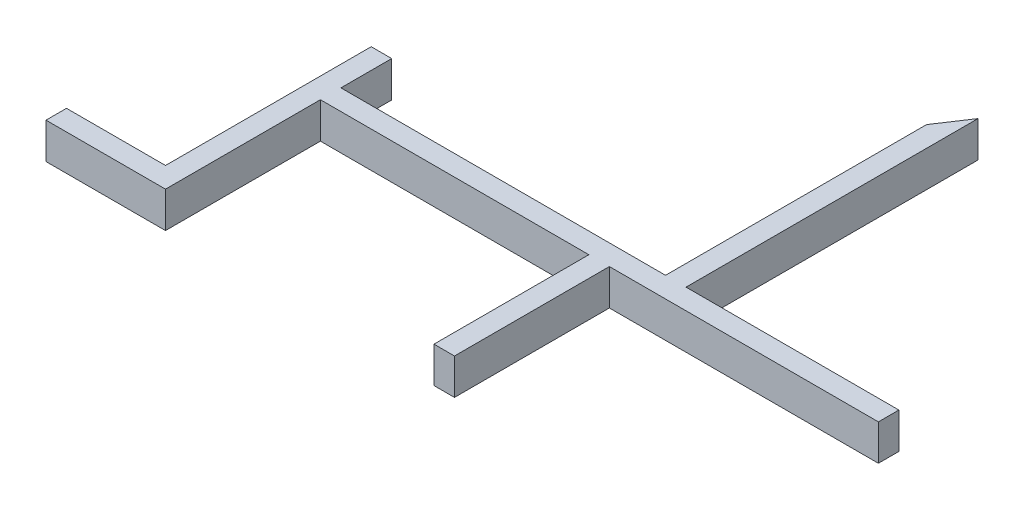
ISO-10303-21;
HEADER;
FILE_DESCRIPTION(('STEP AP214'),'2;1');
FILE_NAME('part.step','',(''),(''),'','','');
FILE_SCHEMA(('AUTOMOTIVE_DESIGN { 1 0 10303 214 1 1 1 1 }'));
ENDSEC;
DATA;
#1=APPLICATION_CONTEXT('core data for automotive mechanical design processes');
#2=APPLICATION_PROTOCOL_DEFINITION('international standard','automotive_design',2000,#1);
#3=PRODUCT_CONTEXT('',#1,'mechanical');
#4=PRODUCT('Part','Part','',(#3));
#5=PRODUCT_RELATED_PRODUCT_CATEGORY('part','',(#4));
#6=PRODUCT_DEFINITION_FORMATION('','',#4);
#7=PRODUCT_DEFINITION_CONTEXT('part definition',#1,'design');
#8=PRODUCT_DEFINITION('design','',#6,#7);
#9=PRODUCT_DEFINITION_SHAPE('','',#8);
#10=(LENGTH_UNIT() NAMED_UNIT(*) SI_UNIT(.MILLI.,.METRE.));
#11=(NAMED_UNIT(*) PLANE_ANGLE_UNIT() SI_UNIT($,.RADIAN.));
#12=(NAMED_UNIT(*) SI_UNIT($,.STERADIAN.) SOLID_ANGLE_UNIT());
#13=UNCERTAINTY_MEASURE_WITH_UNIT(LENGTH_MEASURE(1.E-05),#10,'distance_accuracy_value','');
#14=(GEOMETRIC_REPRESENTATION_CONTEXT(3) GLOBAL_UNCERTAINTY_ASSIGNED_CONTEXT((#13)) GLOBAL_UNIT_ASSIGNED_CONTEXT((#10,
#11,#12)) REPRESENTATION_CONTEXT('',''));
#15=CARTESIAN_POINT('',(0.,0.,0.));
#16=DIRECTION('',(0.,0.,1.));
#17=DIRECTION('',(1.,0.,0.));
#18=AXIS2_PLACEMENT_3D('',#15,#16,#17);
#19=CARTESIAN_POINT('',(-35.6052154613306,-0.01,12.3260604981837));
#20=DIRECTION('',(0.833432778374377,0.,0.552620850069165));
#21=DIRECTION('',(0.552620850069165,0.,-0.833432778374377));
#22=AXIS2_PLACEMENT_3D('',#19,#20,#21);
#23=PLANE('',#22);
#24=DIRECTION('',(0.552620850069165,0.,-0.833432778374377));
#25=VECTOR('',#24,1.);
#26=CARTESIAN_POINT('',(-19.0547032836192,7.,-12.6345238627983));
#27=LINE('',#26,#25);
#28=CARTESIAN_POINT('',(-26.3442212969307,7.,-1.64086835724872));
#29=VERTEX_POINT('',#28);
#30=CARTESIAN_POINT('',(-22.3442212969307,7.,-7.67345129920658));
#31=VERTEX_POINT('',#30);
#32=EDGE_CURVE('E11',#29,#31,#27,.T.);
#33=ORIENTED_EDGE('',*,*,#32,.T.);
#34=DIRECTION('',(0.,1.,0.));
#35=VECTOR('',#34,1.);
#36=CARTESIAN_POINT('',(-22.3442212969307,7.,-7.67345129920659));
#37=LINE('',#36,#35);
#38=CARTESIAN_POINT('',(-22.3442212969307,0.,-7.67345129920658));
#39=VERTEX_POINT('',#38);
#40=EDGE_CURVE('E62',#39,#31,#37,.T.);
#41=ORIENTED_EDGE('',*,*,#40,.F.);
#42=DIRECTION('',(0.552620850069165,0.,-0.833432778374377));
#43=VECTOR('',#42,1.);
#44=CARTESIAN_POINT('',(-19.0547032836192,0.,-12.6345238627983));
#45=LINE('',#44,#43);
#46=CARTESIAN_POINT('',(-26.3442212969307,0.,-1.64086835724872));
#47=VERTEX_POINT('',#46);
#48=EDGE_CURVE('E182',#47,#39,#45,.T.);
#49=ORIENTED_EDGE('',*,*,#48,.F.);
#50=DIRECTION('',(0.,-1.,0.));
#51=VECTOR('',#50,1.);
#52=CARTESIAN_POINT('',(-26.3442212969307,7.,-1.64086835724872));
#53=LINE('',#52,#51);
#54=EDGE_CURVE('E49',#29,#47,#53,.T.);
#55=ORIENTED_EDGE('',*,*,#54,.F.);
#56=EDGE_LOOP('',(#33,#41,#49,#55));
#57=FACE_BOUND('',#56,.T.);
#58=ADVANCED_FACE('F42',(#57),#23,.F.);
#59=CARTESIAN_POINT('',(0.,7.,49.2669812670384));
#60=DIRECTION('',(0.,0.,1.));
#61=DIRECTION('',(1.,0.,0.));
#62=AXIS2_PLACEMENT_3D('',#59,#60,#61);
#63=PLANE('',#62);
#64=DIRECTION('',(-1.,0.,0.));
#65=VECTOR('',#64,1.);
#66=CARTESIAN_POINT('',(0.,0.,49.2669812670384));
#67=LINE('',#66,#65);
#68=CARTESIAN_POINT('',(-26.3442212969307,0.,49.2669812670384));
#69=VERTEX_POINT('',#68);
#70=CARTESIAN_POINT('',(-89.6546773788586,0.,49.2669812670384));
#71=VERTEX_POINT('',#70);
#72=EDGE_CURVE('E222',#69,#71,#67,.T.);
#73=ORIENTED_EDGE('',*,*,#72,.T.);
#74=DIRECTION('',(0.,-1.,0.));
#75=VECTOR('',#74,1.);
#76=CARTESIAN_POINT('',(-89.6546773788586,7.,49.2669812670384));
#77=LINE('',#76,#75);
#78=CARTESIAN_POINT('',(-89.6546773788586,7.,49.2669812670384));
#79=VERTEX_POINT('',#78);
#80=EDGE_CURVE('E183',#79,#71,#77,.T.);
#81=ORIENTED_EDGE('',*,*,#80,.F.);
#82=DIRECTION('',(-1.,0.,0.));
#83=VECTOR('',#82,1.);
#84=CARTESIAN_POINT('',(0.,7.,49.2669812670384));
#85=LINE('',#84,#83);
#86=CARTESIAN_POINT('',(-26.3442212969307,7.,49.2669812670384));
#87=VERTEX_POINT('',#86);
#88=EDGE_CURVE('E169',#87,#79,#85,.T.);
#89=ORIENTED_EDGE('',*,*,#88,.F.);
#90=DIRECTION('',(0.,-1.,0.));
#91=VECTOR('',#90,1.);
#92=CARTESIAN_POINT('',(-26.3442212969307,7.,49.2669812670384));
#93=LINE('',#92,#91);
#94=EDGE_CURVE('E176',#87,#69,#93,.T.);
#95=ORIENTED_EDGE('',*,*,#94,.T.);
#96=EDGE_LOOP('',(#73,#81,#89,#95));
#97=FACE_BOUND('',#96,.T.);
#98=ADVANCED_FACE('F185',(#97),#63,.F.);
#99=CARTESIAN_POINT('',(-89.6546773788586,7.,0.));
#100=DIRECTION('',(-1.,0.,0.));
#101=DIRECTION('',(0.,0.,1.));
#102=AXIS2_PLACEMENT_3D('',#99,#100,#101);
#103=PLANE('',#102);
#104=DIRECTION('',(0.,0.,-1.));
#105=VECTOR('',#104,1.);
#106=CARTESIAN_POINT('',(-89.6546773788586,0.,0.));
#107=LINE('',#106,#105);
#108=CARTESIAN_POINT('',(-89.6546773788586,0.,39.3594010694854));
#109=VERTEX_POINT('',#108);
#110=EDGE_CURVE('E224',#71,#109,#107,.T.);
#111=ORIENTED_EDGE('',*,*,#110,.T.);
#112=DIRECTION('',(0.,-1.,0.));
#113=VECTOR('',#112,1.);
#114=CARTESIAN_POINT('',(-89.6546773788586,7.,39.3594010694854));
#115=LINE('',#114,#113);
#116=CARTESIAN_POINT('',(-89.6546773788586,7.,39.3594010694854));
#117=VERTEX_POINT('',#116);
#118=EDGE_CURVE('E291',#117,#109,#115,.T.);
#119=ORIENTED_EDGE('',*,*,#118,.F.);
#120=DIRECTION('',(0.,0.,-1.));
#121=VECTOR('',#120,1.);
#122=CARTESIAN_POINT('',(-89.6546773788586,7.,0.));
#123=LINE('',#122,#121);
#124=EDGE_CURVE('E188',#79,#117,#123,.T.);
#125=ORIENTED_EDGE('',*,*,#124,.F.);
#126=ORIENTED_EDGE('',*,*,#80,.T.);
#127=EDGE_LOOP('',(#111,#119,#125,#126));
#128=FACE_BOUND('',#127,.T.);
#129=ADVANCED_FACE('F302',(#128),#103,.F.);
#130=CARTESIAN_POINT('',(0.,7.,39.3594010694854));
#131=DIRECTION('',(0.,0.,1.));
#132=DIRECTION('',(1.,0.,0.));
#133=AXIS2_PLACEMENT_3D('',#130,#131,#132);
#134=PLANE('',#133);
#135=DIRECTION('',(-1.,0.,0.));
#136=VECTOR('',#135,1.);
#137=CARTESIAN_POINT('',(0.,0.,39.3594010694854));
#138=LINE('',#137,#136);
#139=CARTESIAN_POINT('',(-93.6546773788586,0.,39.3594010694854));
#140=VERTEX_POINT('',#139);
#141=EDGE_CURVE('E226',#109,#140,#138,.T.);
#142=ORIENTED_EDGE('',*,*,#141,.T.);
#143=DIRECTION('',(0.,-1.,0.));
#144=VECTOR('',#143,1.);
#145=CARTESIAN_POINT('',(-93.6546773788586,7.,39.3594010694854));
#146=LINE('',#145,#144);
#147=CARTESIAN_POINT('',(-93.6546773788586,7.,39.3594010694854));
#148=VERTEX_POINT('',#147);
#149=EDGE_CURVE('E288',#148,#140,#146,.T.);
#150=ORIENTED_EDGE('',*,*,#149,.F.);
#151=DIRECTION('',(-1.,0.,0.));
#152=VECTOR('',#151,1.);
#153=CARTESIAN_POINT('',(0.,7.,39.3594010694854));
#154=LINE('',#153,#152);
#155=EDGE_CURVE('E190',#117,#148,#154,.T.);
#156=ORIENTED_EDGE('',*,*,#155,.F.);
#157=ORIENTED_EDGE('',*,*,#118,.T.);
#158=EDGE_LOOP('',(#142,#150,#156,#157));
#159=FACE_BOUND('',#158,.T.);
#160=ADVANCED_FACE('F309',(#159),#134,.F.);
#161=CARTESIAN_POINT('',(-93.6546773788586,7.,0.));
#162=DIRECTION('',(1.,0.,0.));
#163=DIRECTION('',(0.,0.,-1.));
#164=AXIS2_PLACEMENT_3D('',#161,#162,#163);
#165=PLANE('',#164);
#166=DIRECTION('',(0.,0.,1.));
#167=VECTOR('',#166,1.);
#168=CARTESIAN_POINT('',(-93.6546773788586,0.,0.));
#169=LINE('',#168,#167);
#170=CARTESIAN_POINT('',(-93.6546773788586,0.,79.4769799022003));
#171=VERTEX_POINT('',#170);
#172=EDGE_CURVE('E228',#140,#171,#169,.T.);
#173=ORIENTED_EDGE('',*,*,#172,.T.);
#174=DIRECTION('',(0.,-1.,0.));
#175=VECTOR('',#174,1.);
#176=CARTESIAN_POINT('',(-93.6546773788586,7.,79.4769799022003));
#177=LINE('',#176,#175);
#178=CARTESIAN_POINT('',(-93.6546773788586,7.,79.4769799022003));
#179=VERTEX_POINT('',#178);
#180=EDGE_CURVE('E285',#179,#171,#177,.T.);
#181=ORIENTED_EDGE('',*,*,#180,.F.);
#182=DIRECTION('',(0.,0.,1.));
#183=VECTOR('',#182,1.);
#184=CARTESIAN_POINT('',(-93.6546773788586,7.,0.));
#185=LINE('',#184,#183);
#186=EDGE_CURVE('E194',#148,#179,#185,.T.);
#187=ORIENTED_EDGE('',*,*,#186,.F.);
#188=ORIENTED_EDGE('',*,*,#149,.T.);
#189=EDGE_LOOP('',(#173,#181,#187,#188));
#190=FACE_BOUND('',#189,.T.);
#191=ADVANCED_FACE('F312',(#190),#165,.F.);
#192=CARTESIAN_POINT('',(0.,7.,79.4769799022003));
#193=DIRECTION('',(0.,0.,1.));
#194=DIRECTION('',(1.,0.,0.));
#195=AXIS2_PLACEMENT_3D('',#192,#193,#194);
#196=PLANE('',#195);
#197=DIRECTION('',(-1.,0.,0.));
#198=VECTOR('',#197,1.);
#199=CARTESIAN_POINT('',(0.,0.,79.4769799022003));
#200=LINE('',#199,#198);
#201=CARTESIAN_POINT('',(-112.961853745234,0.,79.4769799022003));
#202=VERTEX_POINT('',#201);
#203=EDGE_CURVE('E230',#171,#202,#200,.T.);
#204=ORIENTED_EDGE('',*,*,#203,.T.);
#205=DIRECTION('',(0.,-1.,0.));
#206=VECTOR('',#205,1.);
#207=CARTESIAN_POINT('',(-112.961853745234,7.,79.4769799022003));
#208=LINE('',#207,#206);
#209=CARTESIAN_POINT('',(-112.961853745234,7.,79.4769799022003));
#210=VERTEX_POINT('',#209);
#211=EDGE_CURVE('E282',#210,#202,#208,.T.);
#212=ORIENTED_EDGE('',*,*,#211,.F.);
#213=DIRECTION('',(-1.,0.,0.));
#214=VECTOR('',#213,1.);
#215=CARTESIAN_POINT('',(0.,7.,79.4769799022003));
#216=LINE('',#215,#214);
#217=EDGE_CURVE('E196',#179,#210,#216,.T.);
#218=ORIENTED_EDGE('',*,*,#217,.F.);
#219=ORIENTED_EDGE('',*,*,#180,.T.);
#220=EDGE_LOOP('',(#204,#212,#218,#219));
#221=FACE_BOUND('',#220,.T.);
#222=ADVANCED_FACE('F317',(#221),#196,.F.);
#223=CARTESIAN_POINT('',(-112.961853745234,7.,0.));
#224=DIRECTION('',(1.,0.,0.));
#225=DIRECTION('',(0.,0.,-1.));
#226=AXIS2_PLACEMENT_3D('',#223,#224,#225);
#227=PLANE('',#226);
#228=DIRECTION('',(0.,0.,1.));
#229=VECTOR('',#228,1.);
#230=CARTESIAN_POINT('',(-112.961853745234,0.,0.));
#231=LINE('',#230,#229);
#232=CARTESIAN_POINT('',(-112.961853745234,0.,83.4769799022003));
#233=VERTEX_POINT('',#232);
#234=EDGE_CURVE('E232',#202,#233,#231,.T.);
#235=ORIENTED_EDGE('',*,*,#234,.T.);
#236=DIRECTION('',(0.,-1.,0.));
#237=VECTOR('',#236,1.);
#238=CARTESIAN_POINT('',(-112.961853745234,7.,83.4769799022003));
#239=LINE('',#238,#237);
#240=CARTESIAN_POINT('',(-112.961853745234,7.,83.4769799022003));
#241=VERTEX_POINT('',#240);
#242=EDGE_CURVE('E279',#241,#233,#239,.T.);
#243=ORIENTED_EDGE('',*,*,#242,.F.);
#244=DIRECTION('',(0.,0.,1.));
#245=VECTOR('',#244,1.);
#246=CARTESIAN_POINT('',(-112.961853745234,7.,0.));
#247=LINE('',#246,#245);
#248=EDGE_CURVE('E198',#210,#241,#247,.T.);
#249=ORIENTED_EDGE('',*,*,#248,.F.);
#250=ORIENTED_EDGE('',*,*,#211,.T.);
#251=EDGE_LOOP('',(#235,#243,#249,#250));
#252=FACE_BOUND('',#251,.T.);
#253=ADVANCED_FACE('F323',(#252),#227,.F.);
#254=CARTESIAN_POINT('',(0.,7.,83.4769799022003));
#255=DIRECTION('',(0.,0.,-1.));
#256=DIRECTION('',(-1.,0.,0.));
#257=AXIS2_PLACEMENT_3D('',#254,#255,#256);
#258=PLANE('',#257);
#259=DIRECTION('',(1.,0.,0.));
#260=VECTOR('',#259,1.);
#261=CARTESIAN_POINT('',(0.,0.,83.4769799022003));
#262=LINE('',#261,#260);
#263=CARTESIAN_POINT('',(-89.6546773788586,0.,83.4769799022003));
#264=VERTEX_POINT('',#263);
#265=EDGE_CURVE('E234',#233,#264,#262,.T.);
#266=ORIENTED_EDGE('',*,*,#265,.T.);
#267=DIRECTION('',(0.,-1.,0.));
#268=VECTOR('',#267,1.);
#269=CARTESIAN_POINT('',(-89.6546773788586,7.,83.4769799022003));
#270=LINE('',#269,#268);
#271=CARTESIAN_POINT('',(-89.6546773788586,7.,83.4769799022003));
#272=VERTEX_POINT('',#271);
#273=EDGE_CURVE('E276',#272,#264,#270,.T.);
#274=ORIENTED_EDGE('',*,*,#273,.F.);
#275=DIRECTION('',(1.,0.,0.));
#276=VECTOR('',#275,1.);
#277=CARTESIAN_POINT('',(0.,7.,83.4769799022003));
#278=LINE('',#277,#276);
#279=EDGE_CURVE('E200',#241,#272,#278,.T.);
#280=ORIENTED_EDGE('',*,*,#279,.F.);
#281=ORIENTED_EDGE('',*,*,#242,.T.);
#282=EDGE_LOOP('',(#266,#274,#280,#281));
#283=FACE_BOUND('',#282,.T.);
#284=ADVANCED_FACE('F327',(#283),#258,.F.);
#285=CARTESIAN_POINT('',(-89.6546773788586,7.,0.));
#286=DIRECTION('',(-1.,0.,0.));
#287=DIRECTION('',(0.,0.,1.));
#288=AXIS2_PLACEMENT_3D('',#285,#286,#287);
#289=PLANE('',#288);
#290=DIRECTION('',(0.,0.,-1.));
#291=VECTOR('',#290,1.);
#292=CARTESIAN_POINT('',(-89.6546773788586,0.,0.));
#293=LINE('',#292,#291);
#294=CARTESIAN_POINT('',(-89.6546773788586,0.,53.2669812670384));
#295=VERTEX_POINT('',#294);
#296=EDGE_CURVE('E236',#264,#295,#293,.T.);
#297=ORIENTED_EDGE('',*,*,#296,.T.);
#298=DIRECTION('',(0.,-1.,0.));
#299=VECTOR('',#298,1.);
#300=CARTESIAN_POINT('',(-89.6546773788586,7.,53.2669812670384));
#301=LINE('',#300,#299);
#302=CARTESIAN_POINT('',(-89.6546773788586,7.,53.2669812670384));
#303=VERTEX_POINT('',#302);
#304=EDGE_CURVE('E273',#303,#295,#301,.T.);
#305=ORIENTED_EDGE('',*,*,#304,.F.);
#306=DIRECTION('',(0.,0.,-1.));
#307=VECTOR('',#306,1.);
#308=CARTESIAN_POINT('',(-89.6546773788586,7.,0.));
#309=LINE('',#308,#307);
#310=EDGE_CURVE('E202',#272,#303,#309,.T.);
#311=ORIENTED_EDGE('',*,*,#310,.F.);
#312=ORIENTED_EDGE('',*,*,#273,.T.);
#313=EDGE_LOOP('',(#297,#305,#311,#312));
#314=FACE_BOUND('',#313,.T.);
#315=ADVANCED_FACE('F332',(#314),#289,.F.);
#316=CARTESIAN_POINT('',(0.,7.,53.2669812670384));
#317=DIRECTION('',(0.,0.,-1.));
#318=DIRECTION('',(-1.,0.,0.));
#319=AXIS2_PLACEMENT_3D('',#316,#317,#318);
#320=PLANE('',#319);
#321=DIRECTION('',(1.,0.,0.));
#322=VECTOR('',#321,1.);
#323=CARTESIAN_POINT('',(0.,0.,53.2669812670384));
#324=LINE('',#323,#322);
#325=CARTESIAN_POINT('',(-37.2951637960566,0.,53.2669812670384));
#326=VERTEX_POINT('',#325);
#327=EDGE_CURVE('E238',#295,#326,#324,.T.);
#328=ORIENTED_EDGE('',*,*,#327,.T.);
#329=DIRECTION('',(0.,-1.,0.));
#330=VECTOR('',#329,1.);
#331=CARTESIAN_POINT('',(-37.2951637960566,7.,53.2669812670384));
#332=LINE('',#331,#330);
#333=CARTESIAN_POINT('',(-37.2951637960566,7.,53.2669812670384));
#334=VERTEX_POINT('',#333);
#335=EDGE_CURVE('E270',#334,#326,#332,.T.);
#336=ORIENTED_EDGE('',*,*,#335,.F.);
#337=DIRECTION('',(1.,0.,0.));
#338=VECTOR('',#337,1.);
#339=CARTESIAN_POINT('',(0.,7.,53.2669812670384));
#340=LINE('',#339,#338);
#341=EDGE_CURVE('E204',#303,#334,#340,.T.);
#342=ORIENTED_EDGE('',*,*,#341,.F.);
#343=ORIENTED_EDGE('',*,*,#304,.T.);
#344=EDGE_LOOP('',(#328,#336,#342,#343));
#345=FACE_BOUND('',#344,.T.);
#346=ADVANCED_FACE('F338',(#345),#320,.F.);
#347=CARTESIAN_POINT('',(-37.2951637960566,7.,0.));
#348=DIRECTION('',(1.,0.,0.));
#349=DIRECTION('',(0.,0.,-1.));
#350=AXIS2_PLACEMENT_3D('',#347,#348,#349);
#351=PLANE('',#350);
#352=DIRECTION('',(0.,0.,1.));
#353=VECTOR('',#352,1.);
#354=CARTESIAN_POINT('',(-37.2951637960566,0.,0.));
#355=LINE('',#354,#353);
#356=CARTESIAN_POINT('',(-37.2951637960566,0.,83.4769799022003));
#357=VERTEX_POINT('',#356);
#358=EDGE_CURVE('E240',#326,#357,#355,.T.);
#359=ORIENTED_EDGE('',*,*,#358,.T.);
#360=DIRECTION('',(0.,-1.,0.));
#361=VECTOR('',#360,1.);
#362=CARTESIAN_POINT('',(-37.2951637960566,7.,83.4769799022003));
#363=LINE('',#362,#361);
#364=CARTESIAN_POINT('',(-37.2951637960566,7.,83.4769799022003));
#365=VERTEX_POINT('',#364);
#366=EDGE_CURVE('E267',#365,#357,#363,.T.);
#367=ORIENTED_EDGE('',*,*,#366,.F.);
#368=DIRECTION('',(0.,0.,1.));
#369=VECTOR('',#368,1.);
#370=CARTESIAN_POINT('',(-37.2951637960566,7.,0.));
#371=LINE('',#370,#369);
#372=EDGE_CURVE('E206',#334,#365,#371,.T.);
#373=ORIENTED_EDGE('',*,*,#372,.F.);
#374=ORIENTED_EDGE('',*,*,#335,.T.);
#375=EDGE_LOOP('',(#359,#367,#373,#374));
#376=FACE_BOUND('',#375,.T.);
#377=ADVANCED_FACE('F342',(#376),#351,.F.);
#378=CARTESIAN_POINT('',(0.,7.,83.4769799022003));
#379=DIRECTION('',(0.,0.,-1.));
#380=DIRECTION('',(-1.,0.,0.));
#381=AXIS2_PLACEMENT_3D('',#378,#379,#380);
#382=PLANE('',#381);
#383=DIRECTION('',(1.,0.,0.));
#384=VECTOR('',#383,1.);
#385=CARTESIAN_POINT('',(0.,0.,83.4769799022003));
#386=LINE('',#385,#384);
#387=CARTESIAN_POINT('',(-33.2951637960566,0.,83.4769799022003));
#388=VERTEX_POINT('',#387);
#389=EDGE_CURVE('E242',#357,#388,#386,.T.);
#390=ORIENTED_EDGE('',*,*,#389,.T.);
#391=DIRECTION('',(0.,-1.,0.));
#392=VECTOR('',#391,1.);
#393=CARTESIAN_POINT('',(-33.2951637960566,7.,83.4769799022003));
#394=LINE('',#393,#392);
#395=CARTESIAN_POINT('',(-33.2951637960566,7.,83.4769799022003));
#396=VERTEX_POINT('',#395);
#397=EDGE_CURVE('E264',#396,#388,#394,.T.);
#398=ORIENTED_EDGE('',*,*,#397,.F.);
#399=DIRECTION('',(1.,0.,0.));
#400=VECTOR('',#399,1.);
#401=CARTESIAN_POINT('',(0.,7.,83.4769799022003));
#402=LINE('',#401,#400);
#403=EDGE_CURVE('E208',#365,#396,#402,.T.);
#404=ORIENTED_EDGE('',*,*,#403,.F.);
#405=ORIENTED_EDGE('',*,*,#366,.T.);
#406=EDGE_LOOP('',(#390,#398,#404,#405));
#407=FACE_BOUND('',#406,.T.);
#408=ADVANCED_FACE('F347',(#407),#382,.F.);
#409=CARTESIAN_POINT('',(-33.2951637960566,7.,0.));
#410=DIRECTION('',(-1.,0.,0.));
#411=DIRECTION('',(0.,0.,1.));
#412=AXIS2_PLACEMENT_3D('',#409,#410,#411);
#413=PLANE('',#412);
#414=DIRECTION('',(0.,0.,-1.));
#415=VECTOR('',#414,1.);
#416=CARTESIAN_POINT('',(-33.2951637960566,0.,0.));
#417=LINE('',#416,#415);
#418=CARTESIAN_POINT('',(-33.2951637960566,0.,53.2669812670384));
#419=VERTEX_POINT('',#418);
#420=EDGE_CURVE('E244',#388,#419,#417,.T.);
#421=ORIENTED_EDGE('',*,*,#420,.T.);
#422=DIRECTION('',(0.,-1.,0.));
#423=VECTOR('',#422,1.);
#424=CARTESIAN_POINT('',(-33.2951637960566,7.,53.2669812670384));
#425=LINE('',#424,#423);
#426=CARTESIAN_POINT('',(-33.2951637960566,7.,53.2669812670384));
#427=VERTEX_POINT('',#426);
#428=EDGE_CURVE('E261',#427,#419,#425,.T.);
#429=ORIENTED_EDGE('',*,*,#428,.F.);
#430=DIRECTION('',(0.,0.,-1.));
#431=VECTOR('',#430,1.);
#432=CARTESIAN_POINT('',(-33.2951637960566,7.,0.));
#433=LINE('',#432,#431);
#434=EDGE_CURVE('E210',#396,#427,#433,.T.);
#435=ORIENTED_EDGE('',*,*,#434,.F.);
#436=ORIENTED_EDGE('',*,*,#397,.T.);
#437=EDGE_LOOP('',(#421,#429,#435,#436));
#438=FACE_BOUND('',#437,.T.);
#439=ADVANCED_FACE('F353',(#438),#413,.F.);
#440=CARTESIAN_POINT('',(0.,7.,53.2669812670384));
#441=DIRECTION('',(0.,0.,-1.));
#442=DIRECTION('',(-1.,0.,0.));
#443=AXIS2_PLACEMENT_3D('',#440,#441,#442);
#444=PLANE('',#443);
#445=DIRECTION('',(1.,0.,0.));
#446=VECTOR('',#445,1.);
#447=CARTESIAN_POINT('',(0.,0.,53.2669812670384));
#448=LINE('',#447,#446);
#449=CARTESIAN_POINT('',(19.1662854467244,0.,53.2669812670384));
#450=VERTEX_POINT('',#449);
#451=EDGE_CURVE('E246',#419,#450,#448,.T.);
#452=ORIENTED_EDGE('',*,*,#451,.T.);
#453=DIRECTION('',(0.,-1.,0.));
#454=VECTOR('',#453,1.);
#455=CARTESIAN_POINT('',(19.1662854467244,7.,53.2669812670384));
#456=LINE('',#455,#454);
#457=CARTESIAN_POINT('',(19.1662854467244,7.,53.2669812670384));
#458=VERTEX_POINT('',#457);
#459=EDGE_CURVE('E258',#458,#450,#456,.T.);
#460=ORIENTED_EDGE('',*,*,#459,.F.);
#461=DIRECTION('',(1.,0.,0.));
#462=VECTOR('',#461,1.);
#463=CARTESIAN_POINT('',(0.,7.,53.2669812670384));
#464=LINE('',#463,#462);
#465=EDGE_CURVE('E212',#427,#458,#464,.T.);
#466=ORIENTED_EDGE('',*,*,#465,.F.);
#467=ORIENTED_EDGE('',*,*,#428,.T.);
#468=EDGE_LOOP('',(#452,#460,#466,#467));
#469=FACE_BOUND('',#468,.T.);
#470=ADVANCED_FACE('F357',(#469),#444,.F.);
#471=CARTESIAN_POINT('',(19.1662854467244,7.,0.));
#472=DIRECTION('',(-1.,0.,0.));
#473=DIRECTION('',(0.,0.,1.));
#474=AXIS2_PLACEMENT_3D('',#471,#472,#473);
#475=PLANE('',#474);
#476=DIRECTION('',(0.,0.,-1.));
#477=VECTOR('',#476,1.);
#478=CARTESIAN_POINT('',(19.1662854467244,0.,0.));
#479=LINE('',#478,#477);
#480=CARTESIAN_POINT('',(19.1662854467244,0.,49.2669812670384));
#481=VERTEX_POINT('',#480);
#482=EDGE_CURVE('E248',#450,#481,#479,.T.);
#483=ORIENTED_EDGE('',*,*,#482,.T.);
#484=DIRECTION('',(0.,-1.,0.));
#485=VECTOR('',#484,1.);
#486=CARTESIAN_POINT('',(19.1662854467244,7.,49.2669812670384));
#487=LINE('',#486,#485);
#488=CARTESIAN_POINT('',(19.1662854467244,7.,49.2669812670384));
#489=VERTEX_POINT('',#488);
#490=EDGE_CURVE('E255',#489,#481,#487,.T.);
#491=ORIENTED_EDGE('',*,*,#490,.F.);
#492=DIRECTION('',(0.,0.,-1.));
#493=VECTOR('',#492,1.);
#494=CARTESIAN_POINT('',(19.1662854467244,7.,0.));
#495=LINE('',#494,#493);
#496=EDGE_CURVE('E214',#458,#489,#495,.T.);
#497=ORIENTED_EDGE('',*,*,#496,.F.);
#498=ORIENTED_EDGE('',*,*,#459,.T.);
#499=EDGE_LOOP('',(#483,#491,#497,#498));
#500=FACE_BOUND('',#499,.T.);
#501=ADVANCED_FACE('F362',(#500),#475,.F.);
#502=CARTESIAN_POINT('',(0.,7.,49.2669812670384));
#503=DIRECTION('',(0.,0.,1.));
#504=DIRECTION('',(1.,0.,0.));
#505=AXIS2_PLACEMENT_3D('',#502,#503,#504);
#506=PLANE('',#505);
#507=DIRECTION('',(-1.,0.,0.));
#508=VECTOR('',#507,1.);
#509=CARTESIAN_POINT('',(0.,0.,49.2669812670384));
#510=LINE('',#509,#508);
#511=CARTESIAN_POINT('',(-22.3442212969307,0.,49.2669812670384));
#512=VERTEX_POINT('',#511);
#513=EDGE_CURVE('E250',#481,#512,#510,.T.);
#514=ORIENTED_EDGE('',*,*,#513,.T.);
#515=DIRECTION('',(0.,-1.,0.));
#516=VECTOR('',#515,1.);
#517=CARTESIAN_POINT('',(-22.3442212969307,7.,49.2669812670384));
#518=LINE('',#517,#516);
#519=CARTESIAN_POINT('',(-22.3442212969307,7.,49.2669812670384));
#520=VERTEX_POINT('',#519);
#521=EDGE_CURVE('E220',#520,#512,#518,.T.);
#522=ORIENTED_EDGE('',*,*,#521,.F.);
#523=DIRECTION('',(-1.,0.,0.));
#524=VECTOR('',#523,1.);
#525=CARTESIAN_POINT('',(0.,7.,49.2669812670384));
#526=LINE('',#525,#524);
#527=EDGE_CURVE('E216',#489,#520,#526,.T.);
#528=ORIENTED_EDGE('',*,*,#527,.F.);
#529=ORIENTED_EDGE('',*,*,#490,.T.);
#530=EDGE_LOOP('',(#514,#522,#528,#529));
#531=FACE_BOUND('',#530,.T.);
#532=ADVANCED_FACE('F366',(#531),#506,.F.);
#533=CARTESIAN_POINT('',(-22.3442212969307,7.,0.));
#534=DIRECTION('',(-1.,0.,0.));
#535=DIRECTION('',(0.,0.,1.));
#536=AXIS2_PLACEMENT_3D('',#533,#534,#535);
#537=PLANE('',#536);
#538=DIRECTION('',(0.,0.,-1.));
#539=VECTOR('',#538,1.);
#540=CARTESIAN_POINT('',(-22.3442212969307,0.,0.));
#541=LINE('',#540,#539);
#542=EDGE_CURVE('E173',#512,#39,#541,.T.);
#543=ORIENTED_EDGE('',*,*,#542,.T.);
#544=ORIENTED_EDGE('',*,*,#40,.T.);
#545=DIRECTION('',(0.,0.,-1.));
#546=VECTOR('',#545,1.);
#547=CARTESIAN_POINT('',(-22.3442212969307,7.,0.));
#548=LINE('',#547,#546);
#549=EDGE_CURVE('E218',#520,#31,#548,.T.);
#550=ORIENTED_EDGE('',*,*,#549,.F.);
#551=ORIENTED_EDGE('',*,*,#521,.T.);
#552=EDGE_LOOP('',(#543,#544,#550,#551));
#553=FACE_BOUND('',#552,.T.);
#554=ADVANCED_FACE('F368',(#553),#537,.F.);
#555=CARTESIAN_POINT('',(-26.3442212969307,7.,0.));
#556=DIRECTION('',(1.,0.,0.));
#557=DIRECTION('',(0.,0.,-1.));
#558=AXIS2_PLACEMENT_3D('',#555,#556,#557);
#559=PLANE('',#558);
#560=DIRECTION('',(0.,0.,1.));
#561=VECTOR('',#560,1.);
#562=CARTESIAN_POINT('',(-26.3442212969307,7.,0.));
#563=LINE('',#562,#561);
#564=EDGE_CURVE('E165',#29,#87,#563,.T.);
#565=ORIENTED_EDGE('',*,*,#564,.F.);
#566=ORIENTED_EDGE('',*,*,#54,.T.);
#567=DIRECTION('',(0.,0.,1.));
#568=VECTOR('',#567,1.);
#569=CARTESIAN_POINT('',(-26.3442212969307,0.,0.));
#570=LINE('',#569,#568);
#571=EDGE_CURVE('E179',#47,#69,#570,.T.);
#572=ORIENTED_EDGE('',*,*,#571,.T.);
#573=ORIENTED_EDGE('',*,*,#94,.F.);
#574=EDGE_LOOP('',(#565,#566,#572,#573));
#575=FACE_BOUND('',#574,.T.);
#576=ADVANCED_FACE('F177',(#575),#559,.F.);
#577=CARTESIAN_POINT('',(0.,0.,0.));
#578=DIRECTION('',(0.,1.,0.));
#579=DIRECTION('',(0.,0.,1.));
#580=AXIS2_PLACEMENT_3D('',#577,#578,#579);
#581=PLANE('',#580);
#582=ORIENTED_EDGE('',*,*,#571,.F.);
#583=ORIENTED_EDGE('',*,*,#48,.T.);
#584=ORIENTED_EDGE('',*,*,#542,.F.);
#585=ORIENTED_EDGE('',*,*,#513,.F.);
#586=ORIENTED_EDGE('',*,*,#482,.F.);
#587=ORIENTED_EDGE('',*,*,#451,.F.);
#588=ORIENTED_EDGE('',*,*,#420,.F.);
#589=ORIENTED_EDGE('',*,*,#389,.F.);
#590=ORIENTED_EDGE('',*,*,#358,.F.);
#591=ORIENTED_EDGE('',*,*,#327,.F.);
#592=ORIENTED_EDGE('',*,*,#296,.F.);
#593=ORIENTED_EDGE('',*,*,#265,.F.);
#594=ORIENTED_EDGE('',*,*,#234,.F.);
#595=ORIENTED_EDGE('',*,*,#203,.F.);
#596=ORIENTED_EDGE('',*,*,#172,.F.);
#597=ORIENTED_EDGE('',*,*,#141,.F.);
#598=ORIENTED_EDGE('',*,*,#110,.F.);
#599=ORIENTED_EDGE('',*,*,#72,.F.);
#600=EDGE_LOOP('',(#582,#583,#584,#585,#586,#587,#588,#589,#590,#591,#592,#593,#594,#595,#596,
#597,#598,#599));
#601=FACE_BOUND('',#600,.T.);
#602=ADVANCED_FACE('F298',(#601),#581,.F.);
#603=CARTESIAN_POINT('',(0.,7.,0.));
#604=DIRECTION('',(0.,1.,0.));
#605=DIRECTION('',(0.,0.,1.));
#606=AXIS2_PLACEMENT_3D('',#603,#604,#605);
#607=PLANE('',#606);
#608=ORIENTED_EDGE('',*,*,#32,.F.);
#609=ORIENTED_EDGE('',*,*,#564,.T.);
#610=ORIENTED_EDGE('',*,*,#88,.T.);
#611=ORIENTED_EDGE('',*,*,#124,.T.);
#612=ORIENTED_EDGE('',*,*,#155,.T.);
#613=ORIENTED_EDGE('',*,*,#186,.T.);
#614=ORIENTED_EDGE('',*,*,#217,.T.);
#615=ORIENTED_EDGE('',*,*,#248,.T.);
#616=ORIENTED_EDGE('',*,*,#279,.T.);
#617=ORIENTED_EDGE('',*,*,#310,.T.);
#618=ORIENTED_EDGE('',*,*,#341,.T.);
#619=ORIENTED_EDGE('',*,*,#372,.T.);
#620=ORIENTED_EDGE('',*,*,#403,.T.);
#621=ORIENTED_EDGE('',*,*,#434,.T.);
#622=ORIENTED_EDGE('',*,*,#465,.T.);
#623=ORIENTED_EDGE('',*,*,#496,.T.);
#624=ORIENTED_EDGE('',*,*,#527,.T.);
#625=ORIENTED_EDGE('',*,*,#549,.T.);
#626=EDGE_LOOP('',(#608,#609,#610,#611,#612,#613,#614,#615,#616,#617,#618,#619,#620,#621,#622,
#623,#624,#625));
#627=FACE_BOUND('',#626,.T.);
#628=ADVANCED_FACE('F167',(#627),#607,.T.);
#629=CLOSED_SHELL('',(#58,#98,#129,#160,#191,#222,#253,#284,#315,#346,#377,#408,#439,#470,#501,
#532,#554,#576,#602,#628));
#630=MANIFOLD_SOLID_BREP('B2',#629);
#631=ADVANCED_BREP_SHAPE_REPRESENTATION('',(#18,#630),#14);
#632=SHAPE_DEFINITION_REPRESENTATION(#9,#631);
ENDSEC;
END-ISO-10303-21;
